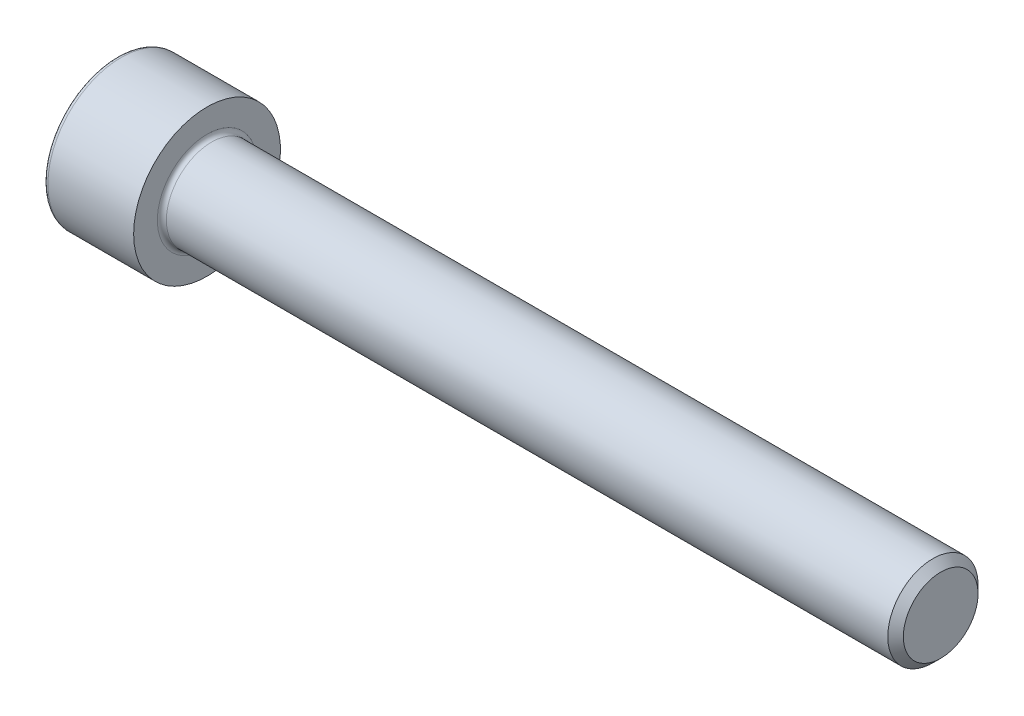
ISO-10303-21;
HEADER;
FILE_DESCRIPTION(('STEP AP214'),'2;1');
FILE_NAME('part.step','',(''),(''),'','','');
FILE_SCHEMA(('AUTOMOTIVE_DESIGN { 1 0 10303 214 1 1 1 1 }'));
ENDSEC;
DATA;
#1=APPLICATION_CONTEXT('core data for automotive mechanical design processes');
#2=APPLICATION_PROTOCOL_DEFINITION('international standard','automotive_design',2000,#1);
#3=PRODUCT_CONTEXT('',#1,'mechanical');
#4=PRODUCT('Part','Part','',(#3));
#5=PRODUCT_RELATED_PRODUCT_CATEGORY('part','',(#4));
#6=PRODUCT_DEFINITION_FORMATION('','',#4);
#7=PRODUCT_DEFINITION_CONTEXT('part definition',#1,'design');
#8=PRODUCT_DEFINITION('design','',#6,#7);
#9=PRODUCT_DEFINITION_SHAPE('','',#8);
#10=(LENGTH_UNIT() NAMED_UNIT(*) SI_UNIT(.MILLI.,.METRE.));
#11=(NAMED_UNIT(*) PLANE_ANGLE_UNIT() SI_UNIT($,.RADIAN.));
#12=(NAMED_UNIT(*) SI_UNIT($,.STERADIAN.) SOLID_ANGLE_UNIT());
#13=UNCERTAINTY_MEASURE_WITH_UNIT(LENGTH_MEASURE(1.E-05),#10,'distance_accuracy_value','');
#14=(GEOMETRIC_REPRESENTATION_CONTEXT(3) GLOBAL_UNCERTAINTY_ASSIGNED_CONTEXT((#13)) GLOBAL_UNIT_ASSIGNED_CONTEXT((#10,
#11,#12)) REPRESENTATION_CONTEXT('',''));
#15=CARTESIAN_POINT('',(0.,0.,0.));
#16=DIRECTION('',(0.,0.,1.));
#17=DIRECTION('',(1.,0.,0.));
#18=AXIS2_PLACEMENT_3D('',#15,#16,#17);
#19=CARTESIAN_POINT('',(0.,0.,0.));
#20=DIRECTION('',(-1.,0.,0.));
#21=DIRECTION('',(0.,0.,1.));
#22=AXIS2_PLACEMENT_3D('',#19,#20,#21);
#23=PLANE('',#22);
#24=DIRECTION('',(0.,-0.5,0.86602540378444));
#25=VECTOR('',#24,1.);
#26=CARTESIAN_POINT('',(0.,3.51894989071076,0.));
#27=LINE('',#26,#25);
#28=CARTESIAN_POINT('',(0.,3.51894989071076,0.));
#29=VERTEX_POINT('',#28);
#30=CARTESIAN_POINT('',(0.,1.75947494535538,3.0475));
#31=VERTEX_POINT('',#30);
#32=EDGE_CURVE('E246',#29,#31,#27,.T.);
#33=ORIENTED_EDGE('',*,*,#32,.T.);
#34=DIRECTION('',(0.,1.,0.));
#35=VECTOR('',#34,1.);
#36=CARTESIAN_POINT('',(0.,-1.75947494535538,3.0475));
#37=LINE('',#36,#35);
#38=CARTESIAN_POINT('',(0.,-1.75947494535538,3.0475));
#39=VERTEX_POINT('',#38);
#40=EDGE_CURVE('E113',#39,#31,#37,.T.);
#41=ORIENTED_EDGE('',*,*,#40,.F.);
#42=DIRECTION('',(0.,-0.5,-0.866025403784438));
#43=VECTOR('',#42,1.);
#44=CARTESIAN_POINT('',(0.,-1.75947494535538,3.0475));
#45=LINE('',#44,#43);
#46=CARTESIAN_POINT('',(0.,-3.51894989071077,0.));
#47=VERTEX_POINT('',#46);
#48=EDGE_CURVE('E249',#39,#47,#45,.T.);
#49=ORIENTED_EDGE('',*,*,#48,.T.);
#50=DIRECTION('',(0.,0.5,-0.86602540378444));
#51=VECTOR('',#50,1.);
#52=CARTESIAN_POINT('',(0.,-3.51894989071077,0.));
#53=LINE('',#52,#51);
#54=CARTESIAN_POINT('',(0.,-1.75947494535539,-3.0475));
#55=VERTEX_POINT('',#54);
#56=EDGE_CURVE('E252',#47,#55,#53,.T.);
#57=ORIENTED_EDGE('',*,*,#56,.T.);
#58=DIRECTION('',(0.,-1.,0.));
#59=VECTOR('',#58,1.);
#60=CARTESIAN_POINT('',(0.,1.75947494535537,-3.0475));
#61=LINE('',#60,#59);
#62=CARTESIAN_POINT('',(0.,1.75947494535537,-3.0475));
#63=VERTEX_POINT('',#62);
#64=EDGE_CURVE('E255',#63,#55,#61,.T.);
#65=ORIENTED_EDGE('',*,*,#64,.F.);
#66=DIRECTION('',(0.,-0.5,-0.866025403784438));
#67=VECTOR('',#66,1.);
#68=CARTESIAN_POINT('',(0.,3.51894989071076,0.));
#69=LINE('',#68,#67);
#70=EDGE_CURVE('E108',#29,#63,#69,.T.);
#71=ORIENTED_EDGE('',*,*,#70,.F.);
#72=EDGE_LOOP('',(#33,#41,#49,#57,#65,#71));
#73=FACE_BOUND('',#72,.T.);
#74=CARTESIAN_POINT('',(0.,0.,0.));
#75=DIRECTION('',(-1.,0.,0.));
#76=DIRECTION('',(0.,0.,1.));
#77=AXIS2_PLACEMENT_3D('',#74,#75,#76);
#78=CIRCLE('',#77,6.1);
#79=CARTESIAN_POINT('',(0.,0.,6.1));
#80=VERTEX_POINT('',#79);
#81=EDGE_CURVE('E25',#80,#80,#78,.T.);
#82=ORIENTED_EDGE('',*,*,#81,.T.);
#83=EDGE_LOOP('',(#82));
#84=FACE_BOUND('',#83,.T.);
#85=ADVANCED_FACE('F17',(#73,#84),#23,.T.);
#86=CARTESIAN_POINT('',(-31.75,0.,0.));
#87=DIRECTION('',(-1.,0.,0.));
#88=DIRECTION('',(0.,0.,1.));
#89=AXIS2_PLACEMENT_3D('',#86,#87,#88);
#90=CYLINDRICAL_SURFACE('',#89,6.5);
#91=CARTESIAN_POINT('',(0.4,0.,0.));
#92=DIRECTION('',(-1.,0.,0.));
#93=DIRECTION('',(0.,0.,1.));
#94=AXIS2_PLACEMENT_3D('',#91,#92,#93);
#95=CIRCLE('',#94,6.5);
#96=CARTESIAN_POINT('',(0.4,0.,6.5));
#97=VERTEX_POINT('',#96);
#98=EDGE_CURVE('E11',#97,#97,#95,.F.);
#99=ORIENTED_EDGE('',*,*,#98,.T.);
#100=EDGE_LOOP('',(#99));
#101=FACE_BOUND('',#100,.T.);
#102=CARTESIAN_POINT('',(8.,0.,0.));
#103=DIRECTION('',(-1.,0.,0.));
#104=DIRECTION('',(0.,0.,1.));
#105=AXIS2_PLACEMENT_3D('',#102,#103,#104);
#106=CIRCLE('',#105,6.5);
#107=CARTESIAN_POINT('',(8.,0.,6.5));
#108=VERTEX_POINT('',#107);
#109=EDGE_CURVE('E131',#108,#108,#106,.T.);
#110=ORIENTED_EDGE('',*,*,#109,.T.);
#111=EDGE_LOOP('',(#110));
#112=FACE_BOUND('',#111,.T.);
#113=ADVANCED_FACE('F157',(#101,#112),#90,.T.);
#114=CARTESIAN_POINT('',(8.,6.5,0.));
#115=DIRECTION('',(1.,0.,0.));
#116=DIRECTION('',(0.,0.,-1.));
#117=AXIS2_PLACEMENT_3D('',#114,#115,#116);
#118=PLANE('',#117);
#119=CARTESIAN_POINT('',(8.,0.,0.));
#120=DIRECTION('',(1.,0.,0.));
#121=DIRECTION('',(0.,0.,-1.));
#122=AXIS2_PLACEMENT_3D('',#119,#120,#121);
#123=CIRCLE('',#122,4.39999999999991);
#124=CARTESIAN_POINT('',(8.,0.,-4.39999999999991));
#125=VERTEX_POINT('',#124);
#126=EDGE_CURVE('E134',#125,#125,#123,.F.);
#127=ORIENTED_EDGE('',*,*,#126,.T.);
#128=EDGE_LOOP('',(#127));
#129=FACE_BOUND('',#128,.T.);
#130=ORIENTED_EDGE('',*,*,#109,.F.);
#131=EDGE_LOOP('',(#130));
#132=FACE_BOUND('',#131,.T.);
#133=ADVANCED_FACE('F164',(#129,#132),#118,.T.);
#134=CARTESIAN_POINT('',(-31.75,0.,0.));
#135=DIRECTION('',(-1.,0.,0.));
#136=DIRECTION('',(0.,0.,1.));
#137=AXIS2_PLACEMENT_3D('',#134,#135,#136);
#138=CYLINDRICAL_SURFACE('',#137,3.99999999999991);
#139=CARTESIAN_POINT('',(8.4,0.,0.));
#140=DIRECTION('',(1.,0.,0.));
#141=DIRECTION('',(0.,0.,-1.));
#142=AXIS2_PLACEMENT_3D('',#139,#140,#141);
#143=CIRCLE('',#142,3.99999999999991);
#144=CARTESIAN_POINT('',(8.4,0.,-3.99999999999991));
#145=VERTEX_POINT('',#144);
#146=EDGE_CURVE('E137',#145,#145,#143,.T.);
#147=ORIENTED_EDGE('',*,*,#146,.T.);
#148=EDGE_LOOP('',(#147));
#149=FACE_BOUND('',#148,.T.);
#150=CARTESIAN_POINT('',(72.3095,0.,0.));
#151=DIRECTION('',(-1.,0.,0.));
#152=DIRECTION('',(0.,0.,1.));
#153=AXIS2_PLACEMENT_3D('',#150,#151,#152);
#154=CIRCLE('',#153,3.99999999999982);
#155=CARTESIAN_POINT('',(72.3095,0.,3.99999999999982));
#156=VERTEX_POINT('',#155);
#157=EDGE_CURVE('E128',#156,#156,#154,.T.);
#158=ORIENTED_EDGE('',*,*,#157,.T.);
#159=EDGE_LOOP('',(#158));
#160=FACE_BOUND('',#159,.T.);
#161=ADVANCED_FACE('F170',(#149,#160),#138,.T.);
#162=CARTESIAN_POINT('',(73.,0.,0.));
#163=DIRECTION('',(-1.,0.,0.));
#164=DIRECTION('',(0.,0.,1.));
#165=AXIS2_PLACEMENT_3D('',#162,#163,#164);
#166=CONICAL_SURFACE('',#165,3.3095,0.78539816339721);
#167=ORIENTED_EDGE('',*,*,#157,.F.);
#168=EDGE_LOOP('',(#167));
#169=FACE_BOUND('',#168,.T.);
#170=CARTESIAN_POINT('',(73.,0.,0.));
#171=DIRECTION('',(-1.,0.,0.));
#172=DIRECTION('',(0.,0.,1.));
#173=AXIS2_PLACEMENT_3D('',#170,#171,#172);
#174=CIRCLE('',#173,3.3095);
#175=CARTESIAN_POINT('',(73.,0.,3.3095));
#176=VERTEX_POINT('',#175);
#177=EDGE_CURVE('E124',#176,#176,#174,.T.);
#178=ORIENTED_EDGE('',*,*,#177,.T.);
#179=EDGE_LOOP('',(#178));
#180=FACE_BOUND('',#179,.T.);
#181=ADVANCED_FACE('F174',(#169,#180),#166,.T.);
#182=CARTESIAN_POINT('',(73.,3.3095,0.));
#183=DIRECTION('',(1.,0.,0.));
#184=DIRECTION('',(0.,0.,-1.));
#185=AXIS2_PLACEMENT_3D('',#182,#183,#184);
#186=PLANE('',#185);
#187=ORIENTED_EDGE('',*,*,#177,.F.);
#188=EDGE_LOOP('',(#187));
#189=FACE_BOUND('',#188,.T.);
#190=ADVANCED_FACE('F153',(#189),#186,.T.);
#191=CARTESIAN_POINT('',(8.4,0.,0.));
#192=DIRECTION('',(1.,0.,0.));
#193=DIRECTION('',(0.,0.,-1.));
#194=AXIS2_PLACEMENT_3D('',#191,#192,#193);
#195=TOROIDAL_SURFACE('',#194,4.39999999999991,0.4);
#196=ORIENTED_EDGE('',*,*,#146,.F.);
#197=EDGE_LOOP('',(#196));
#198=FACE_BOUND('',#197,.T.);
#199=ORIENTED_EDGE('',*,*,#126,.F.);
#200=EDGE_LOOP('',(#199));
#201=FACE_BOUND('',#200,.T.);
#202=ADVANCED_FACE('F144',(#198,#201),#195,.F.);
#203=CARTESIAN_POINT('',(0.4,0.,0.));
#204=DIRECTION('',(-1.,0.,0.));
#205=DIRECTION('',(0.,0.,1.));
#206=AXIS2_PLACEMENT_3D('',#203,#204,#205);
#207=TOROIDAL_SURFACE('',#206,6.1,0.4);
#208=ORIENTED_EDGE('',*,*,#98,.F.);
#209=EDGE_LOOP('',(#208));
#210=FACE_BOUND('',#209,.T.);
#211=ORIENTED_EDGE('',*,*,#81,.F.);
#212=EDGE_LOOP('',(#211));
#213=FACE_BOUND('',#212,.T.);
#214=ADVANCED_FACE('F19',(#210,#213),#207,.T.);
#215=CARTESIAN_POINT('',(4.,3.51894989071076,0.));
#216=DIRECTION('',(0.,-0.86602540378444,-0.5));
#217=DIRECTION('',(0.,0.5,-0.86602540378444));
#218=AXIS2_PLACEMENT_3D('',#215,#216,#217);
#219=PLANE('',#218);
#220=ORIENTED_EDGE('',*,*,#32,.F.);
#221=DIRECTION('',(-1.,0.,0.));
#222=VECTOR('',#221,1.);
#223=CARTESIAN_POINT('',(4.,3.51894989071076,0.));
#224=LINE('',#223,#222);
#225=CARTESIAN_POINT('',(4.,3.51894989071076,0.));
#226=VERTEX_POINT('',#225);
#227=EDGE_CURVE('E236',#226,#29,#224,.T.);
#228=ORIENTED_EDGE('',*,*,#227,.F.);
#229=DIRECTION('',(0.,-0.5,0.86602540378444));
#230=VECTOR('',#229,1.);
#231=CARTESIAN_POINT('',(4.,3.51894989071076,0.));
#232=LINE('',#231,#230);
#233=CARTESIAN_POINT('',(4.,2.63921241803307,1.52375));
#234=VERTEX_POINT('',#233);
#235=EDGE_CURVE('E100',#226,#234,#232,.T.);
#236=ORIENTED_EDGE('',*,*,#235,.T.);
#237=CARTESIAN_POINT('',(4.,1.75947494535538,3.0475));
#238=VERTEX_POINT('',#237);
#239=EDGE_CURVE('E91',#234,#238,#232,.T.);
#240=ORIENTED_EDGE('',*,*,#239,.T.);
#241=DIRECTION('',(-1.,0.,0.));
#242=VECTOR('',#241,1.);
#243=CARTESIAN_POINT('',(4.,1.75947494535538,3.0475));
#244=LINE('',#243,#242);
#245=EDGE_CURVE('E105',#238,#31,#244,.T.);
#246=ORIENTED_EDGE('',*,*,#245,.T.);
#247=EDGE_LOOP('',(#220,#228,#236,#240,#246));
#248=FACE_BOUND('',#247,.T.);
#249=ADVANCED_FACE('F104',(#248),#219,.T.);
#250=CARTESIAN_POINT('',(4.,-1.75947494535538,3.0475));
#251=DIRECTION('',(0.,0.,1.));
#252=DIRECTION('',(0.,-1.,0.));
#253=AXIS2_PLACEMENT_3D('',#250,#251,#252);
#254=PLANE('',#253);
#255=ORIENTED_EDGE('',*,*,#40,.T.);
#256=ORIENTED_EDGE('',*,*,#245,.F.);
#257=DIRECTION('',(0.,1.,0.));
#258=VECTOR('',#257,1.);
#259=CARTESIAN_POINT('',(4.,-1.75947494535538,3.0475));
#260=LINE('',#259,#258);
#261=CARTESIAN_POINT('',(4.,0.,3.0475));
#262=VERTEX_POINT('',#261);
#263=EDGE_CURVE('E88',#262,#238,#260,.T.);
#264=ORIENTED_EDGE('',*,*,#263,.F.);
#265=CARTESIAN_POINT('',(4.,-1.75947494535538,3.0475));
#266=VERTEX_POINT('',#265);
#267=EDGE_CURVE('E99',#266,#262,#260,.T.);
#268=ORIENTED_EDGE('',*,*,#267,.F.);
#269=DIRECTION('',(-1.,0.,0.));
#270=VECTOR('',#269,1.);
#271=CARTESIAN_POINT('',(4.,-1.75947494535538,3.0475));
#272=LINE('',#271,#270);
#273=EDGE_CURVE('E115',#266,#39,#272,.T.);
#274=ORIENTED_EDGE('',*,*,#273,.T.);
#275=EDGE_LOOP('',(#255,#256,#264,#268,#274));
#276=FACE_BOUND('',#275,.T.);
#277=ADVANCED_FACE('F110',(#276),#254,.F.);
#278=CARTESIAN_POINT('',(4.,-1.75947494535538,3.0475));
#279=DIRECTION('',(0.,0.866025403784438,-0.5));
#280=DIRECTION('',(0.,0.5,0.866025403784438));
#281=AXIS2_PLACEMENT_3D('',#278,#279,#280);
#282=PLANE('',#281);
#283=ORIENTED_EDGE('',*,*,#48,.F.);
#284=ORIENTED_EDGE('',*,*,#273,.F.);
#285=DIRECTION('',(0.,-0.5,-0.866025403784438));
#286=VECTOR('',#285,1.);
#287=CARTESIAN_POINT('',(4.,-1.75947494535538,3.0475));
#288=LINE('',#287,#286);
#289=CARTESIAN_POINT('',(4.,-2.63921241803307,1.52375));
#290=VERTEX_POINT('',#289);
#291=EDGE_CURVE('E275',#266,#290,#288,.T.);
#292=ORIENTED_EDGE('',*,*,#291,.T.);
#293=CARTESIAN_POINT('',(4.,-3.51894989071077,0.));
#294=VERTEX_POINT('',#293);
#295=EDGE_CURVE('E264',#290,#294,#288,.T.);
#296=ORIENTED_EDGE('',*,*,#295,.T.);
#297=DIRECTION('',(-1.,0.,0.));
#298=VECTOR('',#297,1.);
#299=CARTESIAN_POINT('',(4.,-3.51894989071077,0.));
#300=LINE('',#299,#298);
#301=EDGE_CURVE('E120',#294,#47,#300,.T.);
#302=ORIENTED_EDGE('',*,*,#301,.T.);
#303=EDGE_LOOP('',(#283,#284,#292,#296,#302));
#304=FACE_BOUND('',#303,.T.);
#305=ADVANCED_FACE('F188',(#304),#282,.T.);
#306=CARTESIAN_POINT('',(4.,-3.51894989071077,0.));
#307=DIRECTION('',(0.,0.86602540378444,0.5));
#308=DIRECTION('',(0.,-0.5,0.86602540378444));
#309=AXIS2_PLACEMENT_3D('',#306,#307,#308);
#310=PLANE('',#309);
#311=ORIENTED_EDGE('',*,*,#56,.F.);
#312=ORIENTED_EDGE('',*,*,#301,.F.);
#313=DIRECTION('',(0.,0.5,-0.86602540378444));
#314=VECTOR('',#313,1.);
#315=CARTESIAN_POINT('',(4.,-3.51894989071077,0.));
#316=LINE('',#315,#314);
#317=CARTESIAN_POINT('',(4.,-2.63921241803308,-1.52375));
#318=VERTEX_POINT('',#317);
#319=EDGE_CURVE('E242',#294,#318,#316,.T.);
#320=ORIENTED_EDGE('',*,*,#319,.T.);
#321=CARTESIAN_POINT('',(4.,-1.75947494535539,-3.0475));
#322=VERTEX_POINT('',#321);
#323=EDGE_CURVE('E274',#318,#322,#316,.T.);
#324=ORIENTED_EDGE('',*,*,#323,.T.);
#325=DIRECTION('',(-1.,0.,0.));
#326=VECTOR('',#325,1.);
#327=CARTESIAN_POINT('',(4.,-1.75947494535539,-3.0475));
#328=LINE('',#327,#326);
#329=EDGE_CURVE('E235',#322,#55,#328,.T.);
#330=ORIENTED_EDGE('',*,*,#329,.T.);
#331=EDGE_LOOP('',(#311,#312,#320,#324,#330));
#332=FACE_BOUND('',#331,.T.);
#333=ADVANCED_FACE('F191',(#332),#310,.T.);
#334=CARTESIAN_POINT('',(4.,1.75947494535537,-3.0475));
#335=DIRECTION('',(0.,0.,-1.));
#336=DIRECTION('',(0.,1.,0.));
#337=AXIS2_PLACEMENT_3D('',#334,#335,#336);
#338=PLANE('',#337);
#339=ORIENTED_EDGE('',*,*,#64,.T.);
#340=ORIENTED_EDGE('',*,*,#329,.F.);
#341=DIRECTION('',(0.,-1.,0.));
#342=VECTOR('',#341,1.);
#343=CARTESIAN_POINT('',(4.,1.75947494535537,-3.0475));
#344=LINE('',#343,#342);
#345=CARTESIAN_POINT('',(4.,0.,-3.0475));
#346=VERTEX_POINT('',#345);
#347=EDGE_CURVE('E239',#346,#322,#344,.T.);
#348=ORIENTED_EDGE('',*,*,#347,.F.);
#349=CARTESIAN_POINT('',(4.,1.75947494535537,-3.0475));
#350=VERTEX_POINT('',#349);
#351=EDGE_CURVE('E32',#350,#346,#344,.T.);
#352=ORIENTED_EDGE('',*,*,#351,.F.);
#353=DIRECTION('',(-1.,0.,0.));
#354=VECTOR('',#353,1.);
#355=CARTESIAN_POINT('',(4.,1.75947494535537,-3.0475));
#356=LINE('',#355,#354);
#357=EDGE_CURVE('E232',#350,#63,#356,.T.);
#358=ORIENTED_EDGE('',*,*,#357,.T.);
#359=EDGE_LOOP('',(#339,#340,#348,#352,#358));
#360=FACE_BOUND('',#359,.T.);
#361=ADVANCED_FACE('F195',(#360),#338,.F.);
#362=CARTESIAN_POINT('',(4.,3.51894989071076,0.));
#363=DIRECTION('',(0.,0.866025403784438,-0.5));
#364=DIRECTION('',(0.,0.5,0.866025403784438));
#365=AXIS2_PLACEMENT_3D('',#362,#363,#364);
#366=PLANE('',#365);
#367=ORIENTED_EDGE('',*,*,#70,.T.);
#368=ORIENTED_EDGE('',*,*,#357,.F.);
#369=DIRECTION('',(0.,-0.5,-0.866025403784438));
#370=VECTOR('',#369,1.);
#371=CARTESIAN_POINT('',(4.,3.51894989071076,0.));
#372=LINE('',#371,#370);
#373=CARTESIAN_POINT('',(4.,2.63921241803307,-1.52375));
#374=VERTEX_POINT('',#373);
#375=EDGE_CURVE('E222',#374,#350,#372,.T.);
#376=ORIENTED_EDGE('',*,*,#375,.F.);
#377=EDGE_CURVE('E228',#226,#374,#372,.T.);
#378=ORIENTED_EDGE('',*,*,#377,.F.);
#379=ORIENTED_EDGE('',*,*,#227,.T.);
#380=EDGE_LOOP('',(#367,#368,#376,#378,#379));
#381=FACE_BOUND('',#380,.T.);
#382=ADVANCED_FACE('F199',(#381),#366,.F.);
#383=CARTESIAN_POINT('',(4.,5.27842483606614,-3.0475));
#384=DIRECTION('',(1.,0.,0.));
#385=DIRECTION('',(0.,0.,-1.));
#386=AXIS2_PLACEMENT_3D('',#383,#384,#385);
#387=PLANE('',#386);
#388=ORIENTED_EDGE('',*,*,#347,.T.);
#389=ORIENTED_EDGE('',*,*,#323,.F.);
#390=CARTESIAN_POINT('',(4.,0.,0.));
#391=DIRECTION('',(-1.,0.,0.));
#392=DIRECTION('',(0.,0.,1.));
#393=AXIS2_PLACEMENT_3D('',#390,#391,#392);
#394=CIRCLE('',#393,3.0475);
#395=EDGE_CURVE('E270',#346,#318,#394,.T.);
#396=ORIENTED_EDGE('',*,*,#395,.F.);
#397=EDGE_LOOP('',(#388,#389,#396));
#398=FACE_BOUND('',#397,.T.);
#399=ADVANCED_FACE('F203',(#398),#387,.F.);
#400=ORIENTED_EDGE('',*,*,#319,.F.);
#401=ORIENTED_EDGE('',*,*,#295,.F.);
#402=EDGE_CURVE('E118',#318,#290,#394,.T.);
#403=ORIENTED_EDGE('',*,*,#402,.F.);
#404=EDGE_LOOP('',(#400,#401,#403));
#405=FACE_BOUND('',#404,.T.);
#406=ADVANCED_FACE('F206',(#405),#387,.F.);
#407=ORIENTED_EDGE('',*,*,#291,.F.);
#408=ORIENTED_EDGE('',*,*,#267,.T.);
#409=EDGE_CURVE('E114',#290,#262,#394,.T.);
#410=ORIENTED_EDGE('',*,*,#409,.F.);
#411=EDGE_LOOP('',(#407,#408,#410));
#412=FACE_BOUND('',#411,.T.);
#413=ADVANCED_FACE('F212',(#412),#387,.F.);
#414=ORIENTED_EDGE('',*,*,#263,.T.);
#415=ORIENTED_EDGE('',*,*,#239,.F.);
#416=EDGE_CURVE('E94',#262,#234,#394,.T.);
#417=ORIENTED_EDGE('',*,*,#416,.F.);
#418=EDGE_LOOP('',(#414,#415,#417));
#419=FACE_BOUND('',#418,.T.);
#420=ADVANCED_FACE('F90',(#419),#387,.F.);
#421=ORIENTED_EDGE('',*,*,#235,.F.);
#422=ORIENTED_EDGE('',*,*,#377,.T.);
#423=EDGE_CURVE('E125',#234,#374,#394,.T.);
#424=ORIENTED_EDGE('',*,*,#423,.F.);
#425=EDGE_LOOP('',(#421,#422,#424));
#426=FACE_BOUND('',#425,.T.);
#427=ADVANCED_FACE('F215',(#426),#387,.F.);
#428=ORIENTED_EDGE('',*,*,#375,.T.);
#429=ORIENTED_EDGE('',*,*,#351,.T.);
#430=EDGE_CURVE('E225',#374,#346,#394,.T.);
#431=ORIENTED_EDGE('',*,*,#430,.F.);
#432=EDGE_LOOP('',(#428,#429,#431));
#433=FACE_BOUND('',#432,.T.);
#434=ADVANCED_FACE('F184',(#433),#387,.F.);
#435=CARTESIAN_POINT('',(4.,0.,0.));
#436=DIRECTION('',(-1.,0.,0.));
#437=DIRECTION('',(0.,0.,1.));
#438=AXIS2_PLACEMENT_3D('',#435,#436,#437);
#439=CONICAL_SURFACE('',#438,3.0475,1.04719755119659);
#440=CARTESIAN_POINT('',(5.75947494535541,0.,0.));
#441=VERTEX_POINT('',#440);
#442=VERTEX_LOOP('',#441);
#443=FACE_BOUND('',#442,.T.);
#444=ORIENTED_EDGE('',*,*,#416,.T.);
#445=ORIENTED_EDGE('',*,*,#423,.T.);
#446=ORIENTED_EDGE('',*,*,#430,.T.);
#447=ORIENTED_EDGE('',*,*,#395,.T.);
#448=ORIENTED_EDGE('',*,*,#402,.T.);
#449=ORIENTED_EDGE('',*,*,#409,.T.);
#450=EDGE_LOOP('',(#444,#445,#446,#447,#448,#449));
#451=FACE_BOUND('',#450,.T.);
#452=ADVANCED_FACE('F182',(#443,#451),#439,.F.);
#453=CLOSED_SHELL('',(#85,#113,#133,#161,#181,#190,#202,#214,#249,#277,#305,#333,#361,#382,#399,
#406,#413,#420,#427,#434,#452));
#454=MANIFOLD_SOLID_BREP('B1',#453);
#455=ADVANCED_BREP_SHAPE_REPRESENTATION('',(#18,#454),#14);
#456=SHAPE_DEFINITION_REPRESENTATION(#9,#455);
ENDSEC;
END-ISO-10303-21;
